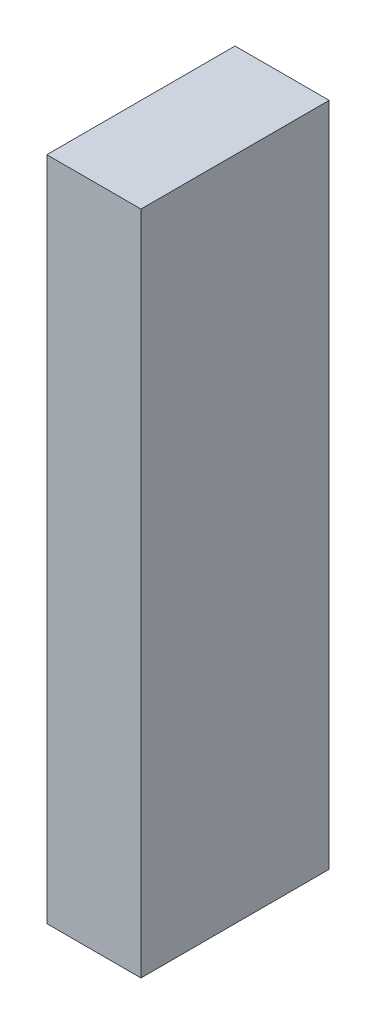
ISO-10303-21;
HEADER;
FILE_DESCRIPTION(('STEP AP214'),'2;1');
FILE_NAME('part.step','',(''),(''),'','','');
FILE_SCHEMA(('AUTOMOTIVE_DESIGN { 1 0 10303 214 1 1 1 1 }'));
ENDSEC;
DATA;
#1=APPLICATION_CONTEXT('core data for automotive mechanical design processes');
#2=APPLICATION_PROTOCOL_DEFINITION('international standard','automotive_design',2000,#1);
#3=PRODUCT_CONTEXT('',#1,'mechanical');
#4=PRODUCT('Part','Part','',(#3));
#5=PRODUCT_RELATED_PRODUCT_CATEGORY('part','',(#4));
#6=PRODUCT_DEFINITION_FORMATION('','',#4);
#7=PRODUCT_DEFINITION_CONTEXT('part definition',#1,'design');
#8=PRODUCT_DEFINITION('design','',#6,#7);
#9=PRODUCT_DEFINITION_SHAPE('','',#8);
#10=(LENGTH_UNIT() NAMED_UNIT(*) SI_UNIT(.MILLI.,.METRE.));
#11=(NAMED_UNIT(*) PLANE_ANGLE_UNIT() SI_UNIT($,.RADIAN.));
#12=(NAMED_UNIT(*) SI_UNIT($,.STERADIAN.) SOLID_ANGLE_UNIT());
#13=UNCERTAINTY_MEASURE_WITH_UNIT(LENGTH_MEASURE(1.E-05),#10,'distance_accuracy_value','');
#14=(GEOMETRIC_REPRESENTATION_CONTEXT(3) GLOBAL_UNCERTAINTY_ASSIGNED_CONTEXT((#13)) GLOBAL_UNIT_ASSIGNED_CONTEXT((#10,
#11,#12)) REPRESENTATION_CONTEXT('',''));
#15=CARTESIAN_POINT('',(0.,0.,0.));
#16=DIRECTION('',(0.,0.,1.));
#17=DIRECTION('',(1.,0.,0.));
#18=AXIS2_PLACEMENT_3D('',#15,#16,#17);
#19=CARTESIAN_POINT('',(-25.4,359.41,50.8));
#20=DIRECTION('',(1.,0.,0.));
#21=DIRECTION('',(0.,0.,-1.));
#22=AXIS2_PLACEMENT_3D('',#19,#20,#21);
#23=PLANE('',#22);
#24=DIRECTION('',(0.,0.,1.));
#25=VECTOR('',#24,1.);
#26=CARTESIAN_POINT('',(-25.4,0.,50.8));
#27=LINE('',#26,#25);
#28=CARTESIAN_POINT('',(-25.4,0.,-50.8));
#29=VERTEX_POINT('',#28);
#30=CARTESIAN_POINT('',(-25.4,0.,50.8));
#31=VERTEX_POINT('',#30);
#32=EDGE_CURVE('E97',#29,#31,#27,.T.);
#33=ORIENTED_EDGE('',*,*,#32,.T.);
#34=DIRECTION('',(0.,-1.,0.));
#35=VECTOR('',#34,1.);
#36=CARTESIAN_POINT('',(-25.4,359.41,50.8));
#37=LINE('',#36,#35);
#38=CARTESIAN_POINT('',(-25.4,359.41,50.8));
#39=VERTEX_POINT('',#38);
#40=EDGE_CURVE('E11',#39,#31,#37,.T.);
#41=ORIENTED_EDGE('',*,*,#40,.F.);
#42=DIRECTION('',(0.,0.,1.));
#43=VECTOR('',#42,1.);
#44=CARTESIAN_POINT('',(-25.4,359.41,50.8));
#45=LINE('',#44,#43);
#46=CARTESIAN_POINT('',(-25.4,359.41,-50.8));
#47=VERTEX_POINT('',#46);
#48=EDGE_CURVE('E85',#47,#39,#45,.T.);
#49=ORIENTED_EDGE('',*,*,#48,.F.);
#50=DIRECTION('',(0.,-1.,0.));
#51=VECTOR('',#50,1.);
#52=CARTESIAN_POINT('',(-25.4,359.41,-50.8));
#53=LINE('',#52,#51);
#54=EDGE_CURVE('E93',#47,#29,#53,.T.);
#55=ORIENTED_EDGE('',*,*,#54,.T.);
#56=EDGE_LOOP('',(#33,#41,#49,#55));
#57=FACE_BOUND('',#56,.T.);
#58=ADVANCED_FACE('F34',(#57),#23,.F.);
#59=CARTESIAN_POINT('',(-25.4,359.41,50.8));
#60=DIRECTION('',(0.,0.,-1.));
#61=DIRECTION('',(-1.,0.,0.));
#62=AXIS2_PLACEMENT_3D('',#59,#60,#61);
#63=PLANE('',#62);
#64=DIRECTION('',(1.,0.,0.));
#65=VECTOR('',#64,1.);
#66=CARTESIAN_POINT('',(-25.4,0.,50.8));
#67=LINE('',#66,#65);
#68=CARTESIAN_POINT('',(25.4,0.,50.8));
#69=VERTEX_POINT('',#68);
#70=EDGE_CURVE('E89',#31,#69,#67,.T.);
#71=ORIENTED_EDGE('',*,*,#70,.T.);
#72=DIRECTION('',(0.,-1.,0.));
#73=VECTOR('',#72,1.);
#74=CARTESIAN_POINT('',(25.4,359.41,50.8));
#75=LINE('',#74,#73);
#76=CARTESIAN_POINT('',(25.4,359.41,50.8));
#77=VERTEX_POINT('',#76);
#78=EDGE_CURVE('E42',#77,#69,#75,.T.);
#79=ORIENTED_EDGE('',*,*,#78,.F.);
#80=DIRECTION('',(1.,0.,0.));
#81=VECTOR('',#80,1.);
#82=CARTESIAN_POINT('',(-25.4,359.41,50.8));
#83=LINE('',#82,#81);
#84=EDGE_CURVE('E80',#39,#77,#83,.T.);
#85=ORIENTED_EDGE('',*,*,#84,.F.);
#86=ORIENTED_EDGE('',*,*,#40,.T.);
#87=EDGE_LOOP('',(#71,#79,#85,#86));
#88=FACE_BOUND('',#87,.T.);
#89=ADVANCED_FACE('F88',(#88),#63,.F.);
#90=CARTESIAN_POINT('',(25.4,359.41,50.8));
#91=DIRECTION('',(-1.,0.,0.));
#92=DIRECTION('',(0.,0.,1.));
#93=AXIS2_PLACEMENT_3D('',#90,#91,#92);
#94=PLANE('',#93);
#95=DIRECTION('',(0.,0.,-1.));
#96=VECTOR('',#95,1.);
#97=CARTESIAN_POINT('',(25.4,0.,50.8));
#98=LINE('',#97,#96);
#99=CARTESIAN_POINT('',(25.4,0.,-50.8));
#100=VERTEX_POINT('',#99);
#101=EDGE_CURVE('E67',#69,#100,#98,.T.);
#102=ORIENTED_EDGE('',*,*,#101,.T.);
#103=DIRECTION('',(0.,-1.,0.));
#104=VECTOR('',#103,1.);
#105=CARTESIAN_POINT('',(25.4,359.41,-50.8));
#106=LINE('',#105,#104);
#107=CARTESIAN_POINT('',(25.4,359.41,-50.8));
#108=VERTEX_POINT('',#107);
#109=EDGE_CURVE('E90',#108,#100,#106,.T.);
#110=ORIENTED_EDGE('',*,*,#109,.F.);
#111=DIRECTION('',(0.,0.,-1.));
#112=VECTOR('',#111,1.);
#113=CARTESIAN_POINT('',(25.4,359.41,50.8));
#114=LINE('',#113,#112);
#115=EDGE_CURVE('E83',#77,#108,#114,.T.);
#116=ORIENTED_EDGE('',*,*,#115,.F.);
#117=ORIENTED_EDGE('',*,*,#78,.T.);
#118=EDGE_LOOP('',(#102,#110,#116,#117));
#119=FACE_BOUND('',#118,.T.);
#120=ADVANCED_FACE('F91',(#119),#94,.F.);
#121=CARTESIAN_POINT('',(-25.4,359.41,-50.8));
#122=DIRECTION('',(0.,0.,1.));
#123=DIRECTION('',(1.,0.,0.));
#124=AXIS2_PLACEMENT_3D('',#121,#122,#123);
#125=PLANE('',#124);
#126=DIRECTION('',(-1.,0.,0.));
#127=VECTOR('',#126,1.);
#128=CARTESIAN_POINT('',(-25.4,0.,-50.8));
#129=LINE('',#128,#127);
#130=EDGE_CURVE('E73',#100,#29,#129,.T.);
#131=ORIENTED_EDGE('',*,*,#130,.T.);
#132=ORIENTED_EDGE('',*,*,#54,.F.);
#133=DIRECTION('',(-1.,0.,0.));
#134=VECTOR('',#133,1.);
#135=CARTESIAN_POINT('',(-25.4,359.41,-50.8));
#136=LINE('',#135,#134);
#137=EDGE_CURVE('E50',#108,#47,#136,.T.);
#138=ORIENTED_EDGE('',*,*,#137,.F.);
#139=ORIENTED_EDGE('',*,*,#109,.T.);
#140=EDGE_LOOP('',(#131,#132,#138,#139));
#141=FACE_BOUND('',#140,.T.);
#142=ADVANCED_FACE('F104',(#141),#125,.F.);
#143=CARTESIAN_POINT('',(-25.4,359.41,-50.8));
#144=DIRECTION('',(0.,-1.,0.));
#145=DIRECTION('',(0.,0.,-1.));
#146=AXIS2_PLACEMENT_3D('',#143,#144,#145);
#147=PLANE('',#146);
#148=ORIENTED_EDGE('',*,*,#48,.T.);
#149=ORIENTED_EDGE('',*,*,#84,.T.);
#150=ORIENTED_EDGE('',*,*,#115,.T.);
#151=ORIENTED_EDGE('',*,*,#137,.T.);
#152=EDGE_LOOP('',(#148,#149,#150,#151));
#153=FACE_BOUND('',#152,.T.);
#154=ADVANCED_FACE('F81',(#153),#147,.F.);
#155=CARTESIAN_POINT('',(-25.4,0.,-50.8));
#156=DIRECTION('',(0.,-1.,0.));
#157=DIRECTION('',(0.,0.,-1.));
#158=AXIS2_PLACEMENT_3D('',#155,#156,#157);
#159=PLANE('',#158);
#160=ORIENTED_EDGE('',*,*,#32,.F.);
#161=ORIENTED_EDGE('',*,*,#130,.F.);
#162=ORIENTED_EDGE('',*,*,#101,.F.);
#163=ORIENTED_EDGE('',*,*,#70,.F.);
#164=EDGE_LOOP('',(#160,#161,#162,#163));
#165=FACE_BOUND('',#164,.T.);
#166=ADVANCED_FACE('F107',(#165),#159,.T.);
#167=CLOSED_SHELL('',(#58,#89,#120,#142,#154,#166));
#168=MANIFOLD_SOLID_BREP('B2',#167);
#169=ADVANCED_BREP_SHAPE_REPRESENTATION('',(#18,#168),#14);
#170=SHAPE_DEFINITION_REPRESENTATION(#9,#169);
ENDSEC;
END-ISO-10303-21;
